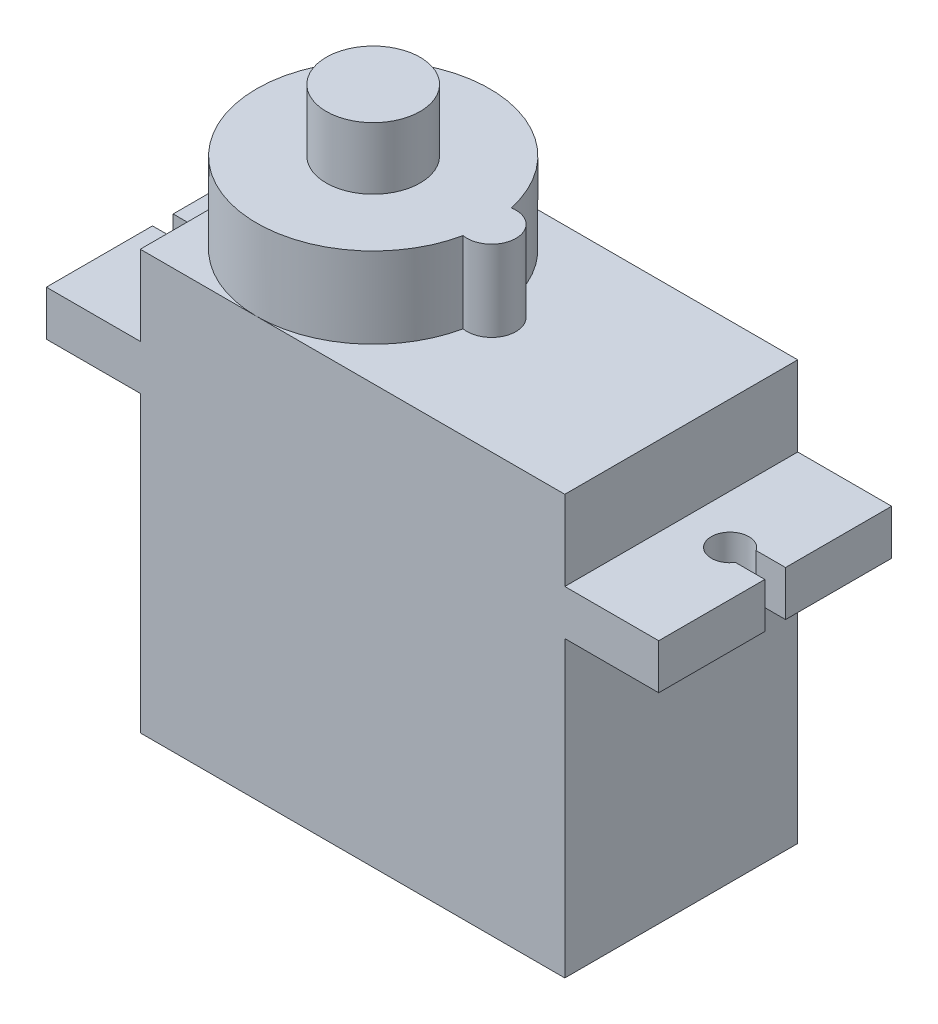
ISO-10303-21;
HEADER;
FILE_DESCRIPTION(('STEP AP214'),'2;1');
FILE_NAME('part.step','',(''),(''),'','','');
FILE_SCHEMA(('AUTOMOTIVE_DESIGN { 1 0 10303 214 1 1 1 1 }'));
ENDSEC;
DATA;
#1=APPLICATION_CONTEXT('core data for automotive mechanical design processes');
#2=APPLICATION_PROTOCOL_DEFINITION('international standard','automotive_design',2000,#1);
#3=PRODUCT_CONTEXT('',#1,'mechanical');
#4=PRODUCT('Part','Part','',(#3));
#5=PRODUCT_RELATED_PRODUCT_CATEGORY('part','',(#4));
#6=PRODUCT_DEFINITION_FORMATION('','',#4);
#7=PRODUCT_DEFINITION_CONTEXT('part definition',#1,'design');
#8=PRODUCT_DEFINITION('design','',#6,#7);
#9=PRODUCT_DEFINITION_SHAPE('','',#8);
#10=(LENGTH_UNIT() NAMED_UNIT(*) SI_UNIT(.MILLI.,.METRE.));
#11=(NAMED_UNIT(*) PLANE_ANGLE_UNIT() SI_UNIT($,.RADIAN.));
#12=(NAMED_UNIT(*) SI_UNIT($,.STERADIAN.) SOLID_ANGLE_UNIT());
#13=UNCERTAINTY_MEASURE_WITH_UNIT(LENGTH_MEASURE(1.E-05),#10,'distance_accuracy_value','');
#14=(GEOMETRIC_REPRESENTATION_CONTEXT(3) GLOBAL_UNCERTAINTY_ASSIGNED_CONTEXT((#13)) GLOBAL_UNIT_ASSIGNED_CONTEXT((#10,
#11,#12)) REPRESENTATION_CONTEXT('',''));
#15=CARTESIAN_POINT('',(0.,0.,0.));
#16=DIRECTION('',(0.,0.,1.));
#17=DIRECTION('',(1.,0.,0.));
#18=AXIS2_PLACEMENT_3D('',#15,#16,#17);
#19=CARTESIAN_POINT('',(-13.6,4.5,1.2));
#20=DIRECTION('',(1.,0.,0.));
#21=DIRECTION('',(0.,0.,-1.));
#22=AXIS2_PLACEMENT_3D('',#19,#20,#21);
#23=CYLINDRICAL_SURFACE('',#22,0.6);
#24=CARTESIAN_POINT('',(-13.6,4.5,1.2));
#25=DIRECTION('',(-1.,0.,0.));
#26=DIRECTION('',(0.,0.,1.));
#27=AXIS2_PLACEMENT_3D('',#24,#25,#26);
#28=CIRCLE('',#27,0.6);
#29=CARTESIAN_POINT('',(-13.6,4.5,1.8));
#30=VERTEX_POINT('',#29);
#31=EDGE_CURVE('E12',#30,#30,#28,.T.);
#32=ORIENTED_EDGE('',*,*,#31,.F.);
#33=EDGE_LOOP('',(#32));
#34=FACE_BOUND('',#33,.T.);
#35=CARTESIAN_POINT('',(-11.3,4.5,1.2));
#36=DIRECTION('',(-1.,0.,0.));
#37=DIRECTION('',(0.,0.,1.));
#38=AXIS2_PLACEMENT_3D('',#35,#36,#37);
#39=CIRCLE('',#38,0.6);
#40=CARTESIAN_POINT('',(-11.3,4.5,1.8));
#41=VERTEX_POINT('',#40);
#42=EDGE_CURVE('E53',#41,#41,#39,.T.);
#43=ORIENTED_EDGE('',*,*,#42,.T.);
#44=EDGE_LOOP('',(#43));
#45=FACE_BOUND('',#44,.T.);
#46=ADVANCED_FACE('F50',(#34,#45),#23,.T.);
#47=CARTESIAN_POINT('',(-13.6,0.,0.));
#48=DIRECTION('',(-1.,0.,0.));
#49=DIRECTION('',(0.,0.,1.));
#50=AXIS2_PLACEMENT_3D('',#47,#48,#49);
#51=PLANE('',#50);
#52=ORIENTED_EDGE('',*,*,#31,.T.);
#53=EDGE_LOOP('',(#52));
#54=FACE_BOUND('',#53,.T.);
#55=ADVANCED_FACE('F65',(#54),#51,.T.);
#56=CARTESIAN_POINT('',(-11.3,0.,0.));
#57=DIRECTION('',(-1.,0.,0.));
#58=DIRECTION('',(0.,0.,1.));
#59=AXIS2_PLACEMENT_3D('',#56,#57,#58);
#60=PLANE('',#59);
#61=ORIENTED_EDGE('',*,*,#42,.F.);
#62=EDGE_LOOP('',(#61));
#63=FACE_BOUND('',#62,.T.);
#64=ADVANCED_FACE('F63',(#63),#60,.F.);
#65=CLOSED_SHELL('',(#46,#55,#64));
#66=MANIFOLD_SOLID_BREP('B2',#65);
#67=CARTESIAN_POINT('',(-13.6,4.5,-1.2));
#68=DIRECTION('',(1.,0.,0.));
#69=DIRECTION('',(0.,0.,-1.));
#70=AXIS2_PLACEMENT_3D('',#67,#68,#69);
#71=CYLINDRICAL_SURFACE('',#70,0.6);
#72=CARTESIAN_POINT('',(-13.6,4.5,-1.2));
#73=DIRECTION('',(-1.,0.,0.));
#74=DIRECTION('',(0.,0.,1.));
#75=AXIS2_PLACEMENT_3D('',#72,#73,#74);
#76=CIRCLE('',#75,0.6);
#77=CARTESIAN_POINT('',(-13.6,4.5,-0.600000000000001));
#78=VERTEX_POINT('',#77);
#79=EDGE_CURVE('E49',#78,#78,#76,.T.);
#80=ORIENTED_EDGE('',*,*,#79,.F.);
#81=EDGE_LOOP('',(#80));
#82=FACE_BOUND('',#81,.T.);
#83=CARTESIAN_POINT('',(-11.3,4.5,-1.2));
#84=DIRECTION('',(-1.,0.,0.));
#85=DIRECTION('',(0.,0.,1.));
#86=AXIS2_PLACEMENT_3D('',#83,#84,#85);
#87=CIRCLE('',#86,0.6);
#88=CARTESIAN_POINT('',(-11.3,4.5,-0.600000000000001));
#89=VERTEX_POINT('',#88);
#90=EDGE_CURVE('E106',#89,#89,#87,.T.);
#91=ORIENTED_EDGE('',*,*,#90,.T.);
#92=EDGE_LOOP('',(#91));
#93=FACE_BOUND('',#92,.T.);
#94=ADVANCED_FACE('F103',(#82,#93),#71,.T.);
#95=CARTESIAN_POINT('',(-13.6,0.,0.));
#96=DIRECTION('',(-1.,0.,0.));
#97=DIRECTION('',(0.,0.,1.));
#98=AXIS2_PLACEMENT_3D('',#95,#96,#97);
#99=PLANE('',#98);
#100=ORIENTED_EDGE('',*,*,#79,.T.);
#101=EDGE_LOOP('',(#100));
#102=FACE_BOUND('',#101,.T.);
#103=ADVANCED_FACE('F118',(#102),#99,.T.);
#104=CARTESIAN_POINT('',(-11.3,0.,0.));
#105=DIRECTION('',(-1.,0.,0.));
#106=DIRECTION('',(0.,0.,1.));
#107=AXIS2_PLACEMENT_3D('',#104,#105,#106);
#108=PLANE('',#107);
#109=ORIENTED_EDGE('',*,*,#90,.F.);
#110=EDGE_LOOP('',(#109));
#111=FACE_BOUND('',#110,.T.);
#112=ADVANCED_FACE('F116',(#111),#108,.F.);
#113=CLOSED_SHELL('',(#94,#103,#112));
#114=MANIFOLD_SOLID_BREP('B7',#113);
#115=CARTESIAN_POINT('',(-13.6,4.5,0.));
#116=DIRECTION('',(1.,0.,0.));
#117=DIRECTION('',(0.,0.,-1.));
#118=AXIS2_PLACEMENT_3D('',#115,#116,#117);
#119=CYLINDRICAL_SURFACE('',#118,0.6);
#120=CARTESIAN_POINT('',(-13.6,4.5,0.));
#121=DIRECTION('',(-1.,0.,0.));
#122=DIRECTION('',(0.,0.,1.));
#123=AXIS2_PLACEMENT_3D('',#120,#121,#122);
#124=CIRCLE('',#123,0.6);
#125=CARTESIAN_POINT('',(-13.6,4.5,0.599999999999999));
#126=VERTEX_POINT('',#125);
#127=EDGE_CURVE('E102',#126,#126,#124,.T.);
#128=ORIENTED_EDGE('',*,*,#127,.F.);
#129=EDGE_LOOP('',(#128));
#130=FACE_BOUND('',#129,.T.);
#131=CARTESIAN_POINT('',(-11.3,4.5,0.));
#132=DIRECTION('',(-1.,0.,0.));
#133=DIRECTION('',(0.,0.,1.));
#134=AXIS2_PLACEMENT_3D('',#131,#132,#133);
#135=CIRCLE('',#134,0.6);
#136=CARTESIAN_POINT('',(-11.3,4.5,0.599999999999999));
#137=VERTEX_POINT('',#136);
#138=EDGE_CURVE('E160',#137,#137,#135,.T.);
#139=ORIENTED_EDGE('',*,*,#138,.T.);
#140=EDGE_LOOP('',(#139));
#141=FACE_BOUND('',#140,.T.);
#142=ADVANCED_FACE('F157',(#130,#141),#119,.T.);
#143=CARTESIAN_POINT('',(-13.6,0.,0.));
#144=DIRECTION('',(-1.,0.,0.));
#145=DIRECTION('',(0.,0.,1.));
#146=AXIS2_PLACEMENT_3D('',#143,#144,#145);
#147=PLANE('',#146);
#148=ORIENTED_EDGE('',*,*,#127,.T.);
#149=EDGE_LOOP('',(#148));
#150=FACE_BOUND('',#149,.T.);
#151=ADVANCED_FACE('F172',(#150),#147,.T.);
#152=CARTESIAN_POINT('',(-11.3,0.,0.));
#153=DIRECTION('',(-1.,0.,0.));
#154=DIRECTION('',(0.,0.,1.));
#155=AXIS2_PLACEMENT_3D('',#152,#153,#154);
#156=PLANE('',#155);
#157=ORIENTED_EDGE('',*,*,#138,.F.);
#158=EDGE_LOOP('',(#157));
#159=FACE_BOUND('',#158,.T.);
#160=ADVANCED_FACE('F170',(#159),#156,.F.);
#161=CLOSED_SHELL('',(#142,#151,#160));
#162=MANIFOLD_SOLID_BREP('B44',#161);
#163=CARTESIAN_POINT('',(0.,22.3,0.));
#164=DIRECTION('',(0.,-1.,0.));
#165=DIRECTION('',(0.,0.,-1.));
#166=AXIS2_PLACEMENT_3D('',#163,#164,#165);
#167=PLANE('',#166);
#168=CARTESIAN_POINT('',(1.2,22.3,0.));
#169=DIRECTION('',(0.,1.,0.));
#170=DIRECTION('',(0.,0.,1.));
#171=AXIS2_PLACEMENT_3D('',#168,#169,#170);
#172=CIRCLE('',#171,1.3);
#173=CARTESIAN_POINT('',(0.966666666666667,22.3,1.27888840621673));
#174=VERTEX_POINT('',#173);
#175=CARTESIAN_POINT('',(0.966666666666667,22.3,-1.27888840621673));
#176=VERTEX_POINT('',#175);
#177=EDGE_CURVE('E377',#174,#176,#172,.T.);
#178=ORIENTED_EDGE('',*,*,#177,.F.);
#179=CARTESIAN_POINT('',(-5.1,22.3,0.));
#180=DIRECTION('',(0.,1.,0.));
#181=DIRECTION('',(0.,0.,1.));
#182=AXIS2_PLACEMENT_3D('',#179,#180,#181);
#183=CIRCLE('',#182,6.2);
#184=CARTESIAN_POINT('',(-5.1,22.3,6.2));
#185=VERTEX_POINT('',#184);
#186=EDGE_CURVE('E225',#185,#174,#183,.T.);
#187=ORIENTED_EDGE('',*,*,#186,.F.);
#188=DIRECTION('',(1.,0.,0.));
#189=VECTOR('',#188,1.);
#190=CARTESIAN_POINT('',(-11.3,22.3,6.2));
#191=LINE('',#190,#189);
#192=CARTESIAN_POINT('',(11.3,22.3,6.2));
#193=VERTEX_POINT('',#192);
#194=EDGE_CURVE('E505',#185,#193,#191,.T.);
#195=ORIENTED_EDGE('',*,*,#194,.T.);
#196=DIRECTION('',(0.,0.,-1.));
#197=VECTOR('',#196,1.);
#198=CARTESIAN_POINT('',(11.3,22.3,6.2));
#199=LINE('',#198,#197);
#200=CARTESIAN_POINT('',(11.3,22.3,-6.2));
#201=VERTEX_POINT('',#200);
#202=EDGE_CURVE('E494',#193,#201,#199,.T.);
#203=ORIENTED_EDGE('',*,*,#202,.T.);
#204=DIRECTION('',(-1.,0.,0.));
#205=VECTOR('',#204,1.);
#206=CARTESIAN_POINT('',(-11.3,22.3,-6.2));
#207=LINE('',#206,#205);
#208=CARTESIAN_POINT('',(-5.1,22.3,-6.2));
#209=VERTEX_POINT('',#208);
#210=EDGE_CURVE('E499',#201,#209,#207,.T.);
#211=ORIENTED_EDGE('',*,*,#210,.T.);
#212=EDGE_CURVE('E219',#176,#209,#183,.T.);
#213=ORIENTED_EDGE('',*,*,#212,.F.);
#214=EDGE_LOOP('',(#178,#187,#195,#203,#211,#213));
#215=FACE_BOUND('',#214,.T.);
#216=ADVANCED_FACE('F202',(#215),#167,.F.);
#217=CARTESIAN_POINT('',(-11.3,22.3,0.));
#218=VERTEX_POINT('',#217);
#219=EDGE_CURVE('E211',#209,#218,#183,.T.);
#220=ORIENTED_EDGE('',*,*,#219,.F.);
#221=CARTESIAN_POINT('',(-11.3,22.3,-6.2));
#222=VERTEX_POINT('',#221);
#223=EDGE_CURVE('E497',#209,#222,#207,.T.);
#224=ORIENTED_EDGE('',*,*,#223,.T.);
#225=DIRECTION('',(0.,0.,1.));
#226=VECTOR('',#225,1.);
#227=CARTESIAN_POINT('',(-11.3,22.3,6.2));
#228=LINE('',#227,#226);
#229=EDGE_CURVE('E502',#222,#218,#228,.T.);
#230=ORIENTED_EDGE('',*,*,#229,.T.);
#231=EDGE_LOOP('',(#220,#224,#230));
#232=FACE_BOUND('',#231,.T.);
#233=ADVANCED_FACE('F595',(#232),#167,.F.);
#234=CARTESIAN_POINT('',(16.3,0.,0.));
#235=DIRECTION('',(1.,0.,0.));
#236=DIRECTION('',(0.,0.,-1.));
#237=AXIS2_PLACEMENT_3D('',#234,#235,#236);
#238=PLANE('',#237);
#239=DIRECTION('',(0.,1.,0.));
#240=VECTOR('',#239,1.);
#241=CARTESIAN_POINT('',(16.3,-0.001000000000001,-0.550000000000001));
#242=LINE('',#241,#240);
#243=CARTESIAN_POINT('',(16.3,15.65,-0.550000000000001));
#244=VERTEX_POINT('',#243);
#245=CARTESIAN_POINT('',(16.3,18.05,-0.550000000000001));
#246=VERTEX_POINT('',#245);
#247=EDGE_CURVE('E404',#244,#246,#242,.T.);
#248=ORIENTED_EDGE('',*,*,#247,.F.);
#249=DIRECTION('',(0.,0.,-1.));
#250=VECTOR('',#249,1.);
#251=CARTESIAN_POINT('',(16.3,15.65,6.2));
#252=LINE('',#251,#250);
#253=CARTESIAN_POINT('',(16.3,15.65,-6.2));
#254=VERTEX_POINT('',#253);
#255=EDGE_CURVE('E466',#244,#254,#252,.T.);
#256=ORIENTED_EDGE('',*,*,#255,.T.);
#257=DIRECTION('',(0.,1.,0.));
#258=VECTOR('',#257,1.);
#259=CARTESIAN_POINT('',(16.3,18.05,-6.2));
#260=LINE('',#259,#258);
#261=CARTESIAN_POINT('',(16.3,18.05,-6.2));
#262=VERTEX_POINT('',#261);
#263=EDGE_CURVE('E471',#254,#262,#260,.T.);
#264=ORIENTED_EDGE('',*,*,#263,.T.);
#265=DIRECTION('',(0.,0.,1.));
#266=VECTOR('',#265,1.);
#267=CARTESIAN_POINT('',(16.3,18.05,6.2));
#268=LINE('',#267,#266);
#269=EDGE_CURVE('E474',#262,#246,#268,.T.);
#270=ORIENTED_EDGE('',*,*,#269,.T.);
#271=EDGE_LOOP('',(#248,#256,#264,#270));
#272=FACE_BOUND('',#271,.T.);
#273=ADVANCED_FACE('F600',(#272),#238,.T.);
#274=CARTESIAN_POINT('',(-16.3,0.,0.));
#275=DIRECTION('',(-1.,0.,0.));
#276=DIRECTION('',(0.,0.,1.));
#277=AXIS2_PLACEMENT_3D('',#274,#275,#276);
#278=PLANE('',#277);
#279=DIRECTION('',(0.,1.,0.));
#280=VECTOR('',#279,1.);
#281=CARTESIAN_POINT('',(-16.3,-0.001000000000001,-0.55));
#282=LINE('',#281,#280);
#283=CARTESIAN_POINT('',(-16.3,15.65,-0.55));
#284=VERTEX_POINT('',#283);
#285=CARTESIAN_POINT('',(-16.3,18.05,-0.55));
#286=VERTEX_POINT('',#285);
#287=EDGE_CURVE('E424',#284,#286,#282,.T.);
#288=ORIENTED_EDGE('',*,*,#287,.T.);
#289=DIRECTION('',(0.,0.,-1.));
#290=VECTOR('',#289,1.);
#291=CARTESIAN_POINT('',(-16.3,18.05,6.2));
#292=LINE('',#291,#290);
#293=CARTESIAN_POINT('',(-16.3,18.05,-6.2));
#294=VERTEX_POINT('',#293);
#295=EDGE_CURVE('E437',#286,#294,#292,.T.);
#296=ORIENTED_EDGE('',*,*,#295,.T.);
#297=DIRECTION('',(0.,-1.,0.));
#298=VECTOR('',#297,1.);
#299=CARTESIAN_POINT('',(-16.3,18.05,-6.2));
#300=LINE('',#299,#298);
#301=CARTESIAN_POINT('',(-16.3,15.65,-6.2));
#302=VERTEX_POINT('',#301);
#303=EDGE_CURVE('E436',#294,#302,#300,.T.);
#304=ORIENTED_EDGE('',*,*,#303,.T.);
#305=DIRECTION('',(0.,0.,1.));
#306=VECTOR('',#305,1.);
#307=CARTESIAN_POINT('',(-16.3,15.65,-6.2));
#308=LINE('',#307,#306);
#309=EDGE_CURVE('E440',#302,#284,#308,.T.);
#310=ORIENTED_EDGE('',*,*,#309,.T.);
#311=EDGE_LOOP('',(#288,#296,#304,#310));
#312=FACE_BOUND('',#311,.T.);
#313=ADVANCED_FACE('F617',(#312),#278,.T.);
#314=CARTESIAN_POINT('',(-11.3,22.3,6.2));
#315=DIRECTION('',(1.,0.,0.));
#316=DIRECTION('',(0.,0.,-1.));
#317=AXIS2_PLACEMENT_3D('',#314,#315,#316);
#318=PLANE('',#317);
#319=DIRECTION('',(0.,0.,-1.));
#320=VECTOR('',#319,1.);
#321=CARTESIAN_POINT('',(-11.3,18.05,6.2));
#322=LINE('',#321,#320);
#323=CARTESIAN_POINT('',(-11.3,18.05,6.2));
#324=VERTEX_POINT('',#323);
#325=CARTESIAN_POINT('',(-11.3,18.05,-6.2));
#326=VERTEX_POINT('',#325);
#327=EDGE_CURVE('E411',#324,#326,#322,.T.);
#328=ORIENTED_EDGE('',*,*,#327,.F.);
#329=DIRECTION('',(0.,-1.,0.));
#330=VECTOR('',#329,1.);
#331=CARTESIAN_POINT('',(-11.3,22.3,6.2));
#332=LINE('',#331,#330);
#333=CARTESIAN_POINT('',(-11.3,22.3,6.2));
#334=VERTEX_POINT('',#333);
#335=EDGE_CURVE('E523',#334,#324,#332,.T.);
#336=ORIENTED_EDGE('',*,*,#335,.F.);
#337=EDGE_CURVE('E501',#218,#334,#228,.T.);
#338=ORIENTED_EDGE('',*,*,#337,.F.);
#339=ORIENTED_EDGE('',*,*,#229,.F.);
#340=DIRECTION('',(0.,-1.,0.));
#341=VECTOR('',#340,1.);
#342=CARTESIAN_POINT('',(-11.3,22.3,-6.2));
#343=LINE('',#342,#341);
#344=EDGE_CURVE('E526',#222,#326,#343,.T.);
#345=ORIENTED_EDGE('',*,*,#344,.T.);
#346=EDGE_LOOP('',(#328,#336,#338,#339,#345));
#347=FACE_BOUND('',#346,.T.);
#348=ADVANCED_FACE('F565',(#347),#318,.F.);
#349=DIRECTION('',(0.,0.,1.));
#350=VECTOR('',#349,1.);
#351=CARTESIAN_POINT('',(-11.3,15.65,-6.2));
#352=LINE('',#351,#350);
#353=CARTESIAN_POINT('',(-11.3,15.65,-6.2));
#354=VERTEX_POINT('',#353);
#355=CARTESIAN_POINT('',(-11.3,15.65,6.2));
#356=VERTEX_POINT('',#355);
#357=EDGE_CURVE('E448',#354,#356,#352,.T.);
#358=ORIENTED_EDGE('',*,*,#357,.F.);
#359=CARTESIAN_POINT('',(-11.3,0.,-6.2));
#360=VERTEX_POINT('',#359);
#361=EDGE_CURVE('E525',#354,#360,#343,.T.);
#362=ORIENTED_EDGE('',*,*,#361,.T.);
#363=DIRECTION('',(0.,0.,1.));
#364=VECTOR('',#363,1.);
#365=CARTESIAN_POINT('',(-11.3,0.,6.2));
#366=LINE('',#365,#364);
#367=CARTESIAN_POINT('',(-11.3,0.,6.2));
#368=VERTEX_POINT('',#367);
#369=EDGE_CURVE('E515',#360,#368,#366,.T.);
#370=ORIENTED_EDGE('',*,*,#369,.T.);
#371=EDGE_CURVE('E522',#356,#368,#332,.T.);
#372=ORIENTED_EDGE('',*,*,#371,.F.);
#373=EDGE_LOOP('',(#358,#362,#370,#372));
#374=FACE_BOUND('',#373,.T.);
#375=ADVANCED_FACE('F533',(#374),#318,.F.);
#376=CARTESIAN_POINT('',(11.3,22.3,6.2));
#377=DIRECTION('',(-1.,0.,0.));
#378=DIRECTION('',(0.,0.,1.));
#379=AXIS2_PLACEMENT_3D('',#376,#377,#378);
#380=PLANE('',#379);
#381=DIRECTION('',(0.,0.,1.));
#382=VECTOR('',#381,1.);
#383=CARTESIAN_POINT('',(11.3,18.05,6.2));
#384=LINE('',#383,#382);
#385=CARTESIAN_POINT('',(11.3,18.05,-6.2));
#386=VERTEX_POINT('',#385);
#387=CARTESIAN_POINT('',(11.3,18.05,6.2));
#388=VERTEX_POINT('',#387);
#389=EDGE_CURVE('E467',#386,#388,#384,.T.);
#390=ORIENTED_EDGE('',*,*,#389,.F.);
#391=DIRECTION('',(0.,-1.,0.));
#392=VECTOR('',#391,1.);
#393=CARTESIAN_POINT('',(11.3,22.3,-6.2));
#394=LINE('',#393,#392);
#395=EDGE_CURVE('E206',#201,#386,#394,.T.);
#396=ORIENTED_EDGE('',*,*,#395,.F.);
#397=ORIENTED_EDGE('',*,*,#202,.F.);
#398=DIRECTION('',(0.,-1.,0.));
#399=VECTOR('',#398,1.);
#400=CARTESIAN_POINT('',(11.3,22.3,6.2));
#401=LINE('',#400,#399);
#402=EDGE_CURVE('E520',#193,#388,#401,.T.);
#403=ORIENTED_EDGE('',*,*,#402,.T.);
#404=EDGE_LOOP('',(#390,#396,#397,#403));
#405=FACE_BOUND('',#404,.T.);
#406=ADVANCED_FACE('F204',(#405),#380,.F.);
#407=DIRECTION('',(0.,0.,-1.));
#408=VECTOR('',#407,1.);
#409=CARTESIAN_POINT('',(11.3,15.65,6.2));
#410=LINE('',#409,#408);
#411=CARTESIAN_POINT('',(11.3,15.65,6.2));
#412=VERTEX_POINT('',#411);
#413=CARTESIAN_POINT('',(11.3,15.65,-6.2));
#414=VERTEX_POINT('',#413);
#415=EDGE_CURVE('E462',#412,#414,#410,.T.);
#416=ORIENTED_EDGE('',*,*,#415,.F.);
#417=CARTESIAN_POINT('',(11.3,0.,6.2));
#418=VERTEX_POINT('',#417);
#419=EDGE_CURVE('E509',#412,#418,#401,.T.);
#420=ORIENTED_EDGE('',*,*,#419,.T.);
#421=DIRECTION('',(0.,0.,-1.));
#422=VECTOR('',#421,1.);
#423=CARTESIAN_POINT('',(11.3,0.,6.2));
#424=LINE('',#423,#422);
#425=CARTESIAN_POINT('',(11.3,0.,-6.2));
#426=VERTEX_POINT('',#425);
#427=EDGE_CURVE('E493',#418,#426,#424,.T.);
#428=ORIENTED_EDGE('',*,*,#427,.T.);
#429=EDGE_CURVE('E527',#414,#426,#394,.T.);
#430=ORIENTED_EDGE('',*,*,#429,.F.);
#431=EDGE_LOOP('',(#416,#420,#428,#430));
#432=FACE_BOUND('',#431,.T.);
#433=ADVANCED_FACE('F614',(#432),#380,.F.);
#434=CARTESIAN_POINT('',(-11.3,22.3,-6.2));
#435=DIRECTION('',(0.,0.,1.));
#436=DIRECTION('',(1.,0.,0.));
#437=AXIS2_PLACEMENT_3D('',#434,#435,#436);
#438=PLANE('',#437);
#439=DIRECTION('',(-1.,0.,0.));
#440=VECTOR('',#439,1.);
#441=CARTESIAN_POINT('',(-11.3,0.,-6.2));
#442=LINE('',#441,#440);
#443=EDGE_CURVE('E512',#426,#360,#442,.T.);
#444=ORIENTED_EDGE('',*,*,#443,.T.);
#445=ORIENTED_EDGE('',*,*,#361,.F.);
#446=DIRECTION('',(1.,0.,0.));
#447=VECTOR('',#446,1.);
#448=CARTESIAN_POINT('',(-16.3,15.65,-6.2));
#449=LINE('',#448,#447);
#450=EDGE_CURVE('E456',#302,#354,#449,.T.);
#451=ORIENTED_EDGE('',*,*,#450,.F.);
#452=ORIENTED_EDGE('',*,*,#303,.F.);
#453=DIRECTION('',(1.,0.,0.));
#454=VECTOR('',#453,1.);
#455=CARTESIAN_POINT('',(-16.3,18.05,-6.2));
#456=LINE('',#455,#454);
#457=EDGE_CURVE('E459',#294,#326,#456,.T.);
#458=ORIENTED_EDGE('',*,*,#457,.T.);
#459=ORIENTED_EDGE('',*,*,#344,.F.);
#460=ORIENTED_EDGE('',*,*,#223,.F.);
#461=ORIENTED_EDGE('',*,*,#210,.F.);
#462=ORIENTED_EDGE('',*,*,#395,.T.);
#463=DIRECTION('',(-1.,0.,0.));
#464=VECTOR('',#463,1.);
#465=CARTESIAN_POINT('',(16.3,18.05,-6.2));
#466=LINE('',#465,#464);
#467=EDGE_CURVE('E484',#262,#386,#466,.T.);
#468=ORIENTED_EDGE('',*,*,#467,.F.);
#469=ORIENTED_EDGE('',*,*,#263,.F.);
#470=DIRECTION('',(-1.,0.,0.));
#471=VECTOR('',#470,1.);
#472=CARTESIAN_POINT('',(16.3,15.65,-6.2));
#473=LINE('',#472,#471);
#474=EDGE_CURVE('E487',#254,#414,#473,.T.);
#475=ORIENTED_EDGE('',*,*,#474,.T.);
#476=ORIENTED_EDGE('',*,*,#429,.T.);
#477=EDGE_LOOP('',(#444,#445,#451,#452,#458,#459,#460,#461,#462,#468,#469,#475,#476));
#478=FACE_BOUND('',#477,.T.);
#479=ADVANCED_FACE('F539',(#478),#438,.F.);
#480=CARTESIAN_POINT('',(-11.3,22.3,6.2));
#481=DIRECTION('',(0.,0.,-1.));
#482=DIRECTION('',(-1.,0.,0.));
#483=AXIS2_PLACEMENT_3D('',#480,#481,#482);
#484=PLANE('',#483);
#485=DIRECTION('',(1.,0.,0.));
#486=VECTOR('',#485,1.);
#487=CARTESIAN_POINT('',(-11.3,0.,6.2));
#488=LINE('',#487,#486);
#489=EDGE_CURVE('E498',#368,#418,#488,.T.);
#490=ORIENTED_EDGE('',*,*,#489,.T.);
#491=ORIENTED_EDGE('',*,*,#419,.F.);
#492=DIRECTION('',(-1.,0.,0.));
#493=VECTOR('',#492,1.);
#494=CARTESIAN_POINT('',(16.3,15.65,6.2));
#495=LINE('',#494,#493);
#496=CARTESIAN_POINT('',(16.3,15.65,6.2));
#497=VERTEX_POINT('',#496);
#498=EDGE_CURVE('E490',#497,#412,#495,.T.);
#499=ORIENTED_EDGE('',*,*,#498,.F.);
#500=DIRECTION('',(0.,-1.,0.));
#501=VECTOR('',#500,1.);
#502=CARTESIAN_POINT('',(16.3,18.05,6.2));
#503=LINE('',#502,#501);
#504=CARTESIAN_POINT('',(16.3,18.05,6.2));
#505=VERTEX_POINT('',#504);
#506=EDGE_CURVE('E463',#505,#497,#503,.T.);
#507=ORIENTED_EDGE('',*,*,#506,.F.);
#508=DIRECTION('',(-1.,0.,0.));
#509=VECTOR('',#508,1.);
#510=CARTESIAN_POINT('',(16.3,18.05,6.2));
#511=LINE('',#510,#509);
#512=EDGE_CURVE('E477',#505,#388,#511,.T.);
#513=ORIENTED_EDGE('',*,*,#512,.T.);
#514=ORIENTED_EDGE('',*,*,#402,.F.);
#515=ORIENTED_EDGE('',*,*,#194,.F.);
#516=EDGE_CURVE('E506',#334,#185,#191,.T.);
#517=ORIENTED_EDGE('',*,*,#516,.F.);
#518=ORIENTED_EDGE('',*,*,#335,.T.);
#519=DIRECTION('',(1.,0.,0.));
#520=VECTOR('',#519,1.);
#521=CARTESIAN_POINT('',(-16.3,18.05,6.2));
#522=LINE('',#521,#520);
#523=CARTESIAN_POINT('',(-16.3,18.05,6.2));
#524=VERTEX_POINT('',#523);
#525=EDGE_CURVE('E445',#524,#324,#522,.T.);
#526=ORIENTED_EDGE('',*,*,#525,.F.);
#527=DIRECTION('',(0.,1.,0.));
#528=VECTOR('',#527,1.);
#529=CARTESIAN_POINT('',(-16.3,15.65,6.2));
#530=LINE('',#529,#528);
#531=CARTESIAN_POINT('',(-16.3,15.65,6.2));
#532=VERTEX_POINT('',#531);
#533=EDGE_CURVE('E443',#532,#524,#530,.T.);
#534=ORIENTED_EDGE('',*,*,#533,.F.);
#535=DIRECTION('',(1.,0.,0.));
#536=VECTOR('',#535,1.);
#537=CARTESIAN_POINT('',(-16.3,15.65,6.2));
#538=LINE('',#537,#536);
#539=EDGE_CURVE('E453',#532,#356,#538,.T.);
#540=ORIENTED_EDGE('',*,*,#539,.T.);
#541=ORIENTED_EDGE('',*,*,#371,.T.);
#542=EDGE_LOOP('',(#490,#491,#499,#507,#513,#514,#515,#517,#518,#526,#534,#540,#541));
#543=FACE_BOUND('',#542,.T.);
#544=ADVANCED_FACE('F545',(#543),#484,.F.);
#545=EDGE_CURVE('E572',#218,#185,#183,.T.);
#546=ORIENTED_EDGE('',*,*,#545,.F.);
#547=ORIENTED_EDGE('',*,*,#337,.T.);
#548=ORIENTED_EDGE('',*,*,#516,.T.);
#549=EDGE_LOOP('',(#546,#547,#548));
#550=FACE_BOUND('',#549,.T.);
#551=ADVANCED_FACE('F571',(#550),#167,.F.);
#552=CARTESIAN_POINT('',(0.,0.,0.));
#553=DIRECTION('',(0.,-1.,0.));
#554=DIRECTION('',(0.,0.,-1.));
#555=AXIS2_PLACEMENT_3D('',#552,#553,#554);
#556=PLANE('',#555);
#557=ORIENTED_EDGE('',*,*,#427,.F.);
#558=ORIENTED_EDGE('',*,*,#489,.F.);
#559=ORIENTED_EDGE('',*,*,#369,.F.);
#560=ORIENTED_EDGE('',*,*,#443,.F.);
#561=EDGE_LOOP('',(#557,#558,#559,#560));
#562=FACE_BOUND('',#561,.T.);
#563=ADVANCED_FACE('F542',(#562),#556,.T.);
#564=CARTESIAN_POINT('',(16.3,15.65,6.2));
#565=DIRECTION('',(0.,1.,0.));
#566=DIRECTION('',(0.,0.,1.));
#567=AXIS2_PLACEMENT_3D('',#564,#565,#566);
#568=PLANE('',#567);
#569=ORIENTED_EDGE('',*,*,#255,.F.);
#570=DIRECTION('',(1.,0.,0.));
#571=VECTOR('',#570,1.);
#572=CARTESIAN_POINT('',(16.3,15.65,-0.550000000000001));
#573=LINE('',#572,#571);
#574=CARTESIAN_POINT('',(14.7351646544245,15.65,-0.550000000000001));
#575=VERTEX_POINT('',#574);
#576=EDGE_CURVE('E389',#575,#244,#573,.T.);
#577=ORIENTED_EDGE('',*,*,#576,.F.);
#578=CARTESIAN_POINT('',(13.9,15.65,0.));
#579=DIRECTION('',(0.,1.,0.));
#580=DIRECTION('',(0.,0.,1.));
#581=AXIS2_PLACEMENT_3D('',#578,#579,#580);
#582=CIRCLE('',#581,1.);
#583=CARTESIAN_POINT('',(14.7351646544245,15.65,0.549999999999999));
#584=VERTEX_POINT('',#583);
#585=EDGE_CURVE('E386',#584,#575,#582,.F.);
#586=ORIENTED_EDGE('',*,*,#585,.F.);
#587=DIRECTION('',(-1.,0.,0.));
#588=VECTOR('',#587,1.);
#589=CARTESIAN_POINT('',(16.3,15.65,0.549999999999999));
#590=LINE('',#589,#588);
#591=CARTESIAN_POINT('',(16.3,15.65,0.549999999999999));
#592=VERTEX_POINT('',#591);
#593=EDGE_CURVE('E403',#592,#584,#590,.T.);
#594=ORIENTED_EDGE('',*,*,#593,.F.);
#595=EDGE_CURVE('E468',#497,#592,#252,.T.);
#596=ORIENTED_EDGE('',*,*,#595,.F.);
#597=ORIENTED_EDGE('',*,*,#498,.T.);
#598=ORIENTED_EDGE('',*,*,#415,.T.);
#599=ORIENTED_EDGE('',*,*,#474,.F.);
#600=EDGE_LOOP('',(#569,#577,#586,#594,#596,#597,#598,#599));
#601=FACE_BOUND('',#600,.T.);
#602=ADVANCED_FACE('F609',(#601),#568,.F.);
#603=CARTESIAN_POINT('',(16.3,18.05,6.2));
#604=DIRECTION('',(0.,-1.,0.));
#605=DIRECTION('',(0.,0.,-1.));
#606=AXIS2_PLACEMENT_3D('',#603,#604,#605);
#607=PLANE('',#606);
#608=CARTESIAN_POINT('',(13.9,18.05,0.));
#609=DIRECTION('',(0.,1.,0.));
#610=DIRECTION('',(0.,0.,1.));
#611=AXIS2_PLACEMENT_3D('',#608,#609,#610);
#612=CIRCLE('',#611,1.);
#613=CARTESIAN_POINT('',(14.7351646544245,18.05,-0.550000000000001));
#614=VERTEX_POINT('',#613);
#615=CARTESIAN_POINT('',(14.7351646544245,18.05,0.549999999999999));
#616=VERTEX_POINT('',#615);
#617=EDGE_CURVE('E392',#614,#616,#612,.T.);
#618=ORIENTED_EDGE('',*,*,#617,.F.);
#619=DIRECTION('',(-1.,0.,0.));
#620=VECTOR('',#619,1.);
#621=CARTESIAN_POINT('',(16.3,18.05,-0.550000000000001));
#622=LINE('',#621,#620);
#623=EDGE_CURVE('E397',#246,#614,#622,.T.);
#624=ORIENTED_EDGE('',*,*,#623,.F.);
#625=ORIENTED_EDGE('',*,*,#269,.F.);
#626=ORIENTED_EDGE('',*,*,#467,.T.);
#627=ORIENTED_EDGE('',*,*,#389,.T.);
#628=ORIENTED_EDGE('',*,*,#512,.F.);
#629=CARTESIAN_POINT('',(16.3,18.05,0.550000000000001));
#630=VERTEX_POINT('',#629);
#631=EDGE_CURVE('E473',#630,#505,#268,.T.);
#632=ORIENTED_EDGE('',*,*,#631,.F.);
#633=DIRECTION('',(1.,0.,0.));
#634=VECTOR('',#633,1.);
#635=CARTESIAN_POINT('',(16.3,18.05,0.549999999999999));
#636=LINE('',#635,#634);
#637=EDGE_CURVE('E395',#616,#630,#636,.T.);
#638=ORIENTED_EDGE('',*,*,#637,.F.);
#639=EDGE_LOOP('',(#618,#624,#625,#626,#627,#628,#632,#638));
#640=FACE_BOUND('',#639,.T.);
#641=ADVANCED_FACE('F800',(#640),#607,.F.);
#642=DIRECTION('',(0.,1.,0.));
#643=VECTOR('',#642,1.);
#644=CARTESIAN_POINT('',(16.3,-0.001000000000001,0.549999999999999));
#645=LINE('',#644,#643);
#646=EDGE_CURVE('E406',#592,#630,#645,.T.);
#647=ORIENTED_EDGE('',*,*,#646,.T.);
#648=ORIENTED_EDGE('',*,*,#631,.T.);
#649=ORIENTED_EDGE('',*,*,#506,.T.);
#650=ORIENTED_EDGE('',*,*,#595,.T.);
#651=EDGE_LOOP('',(#647,#648,#649,#650));
#652=FACE_BOUND('',#651,.T.);
#653=ADVANCED_FACE('F629',(#652),#238,.T.);
#654=CARTESIAN_POINT('',(-16.3,18.05,6.2));
#655=DIRECTION('',(0.,-1.,0.));
#656=DIRECTION('',(0.,0.,-1.));
#657=AXIS2_PLACEMENT_3D('',#654,#655,#656);
#658=PLANE('',#657);
#659=ORIENTED_EDGE('',*,*,#295,.F.);
#660=DIRECTION('',(-1.,0.,0.));
#661=VECTOR('',#660,1.);
#662=CARTESIAN_POINT('',(-16.3,18.05,-0.55));
#663=LINE('',#662,#661);
#664=CARTESIAN_POINT('',(-14.7351646544245,18.05,-0.55));
#665=VERTEX_POINT('',#664);
#666=EDGE_CURVE('E421',#665,#286,#663,.T.);
#667=ORIENTED_EDGE('',*,*,#666,.F.);
#668=CARTESIAN_POINT('',(-13.9,18.05,0.));
#669=DIRECTION('',(0.,1.,0.));
#670=DIRECTION('',(0.,0.,1.));
#671=AXIS2_PLACEMENT_3D('',#668,#669,#670);
#672=CIRCLE('',#671,1.);
#673=CARTESIAN_POINT('',(-14.7351646544245,18.05,0.55));
#674=VERTEX_POINT('',#673);
#675=EDGE_CURVE('E418',#674,#665,#672,.T.);
#676=ORIENTED_EDGE('',*,*,#675,.F.);
#677=DIRECTION('',(1.,0.,0.));
#678=VECTOR('',#677,1.);
#679=CARTESIAN_POINT('',(-16.3,18.05,0.55));
#680=LINE('',#679,#678);
#681=CARTESIAN_POINT('',(-16.3,18.05,0.55));
#682=VERTEX_POINT('',#681);
#683=EDGE_CURVE('E415',#682,#674,#680,.T.);
#684=ORIENTED_EDGE('',*,*,#683,.F.);
#685=EDGE_CURVE('E433',#524,#682,#292,.T.);
#686=ORIENTED_EDGE('',*,*,#685,.F.);
#687=ORIENTED_EDGE('',*,*,#525,.T.);
#688=ORIENTED_EDGE('',*,*,#327,.T.);
#689=ORIENTED_EDGE('',*,*,#457,.F.);
#690=EDGE_LOOP('',(#659,#667,#676,#684,#686,#687,#688,#689));
#691=FACE_BOUND('',#690,.T.);
#692=ADVANCED_FACE('F560',(#691),#658,.F.);
#693=CARTESIAN_POINT('',(-16.3,15.65,-6.2));
#694=DIRECTION('',(0.,1.,0.));
#695=DIRECTION('',(0.,0.,1.));
#696=AXIS2_PLACEMENT_3D('',#693,#694,#695);
#697=PLANE('',#696);
#698=CARTESIAN_POINT('',(-13.9,15.65,0.));
#699=DIRECTION('',(0.,1.,0.));
#700=DIRECTION('',(0.,0.,1.));
#701=AXIS2_PLACEMENT_3D('',#698,#699,#700);
#702=CIRCLE('',#701,1.);
#703=CARTESIAN_POINT('',(-14.7351646544245,15.65,-0.55));
#704=VERTEX_POINT('',#703);
#705=CARTESIAN_POINT('',(-14.7351646544245,15.65,0.55));
#706=VERTEX_POINT('',#705);
#707=EDGE_CURVE('E378',#704,#706,#702,.F.);
#708=ORIENTED_EDGE('',*,*,#707,.F.);
#709=DIRECTION('',(1.,0.,0.));
#710=VECTOR('',#709,1.);
#711=CARTESIAN_POINT('',(-16.3,15.65,-0.55));
#712=LINE('',#711,#710);
#713=EDGE_CURVE('E381',#284,#704,#712,.T.);
#714=ORIENTED_EDGE('',*,*,#713,.F.);
#715=ORIENTED_EDGE('',*,*,#309,.F.);
#716=ORIENTED_EDGE('',*,*,#450,.T.);
#717=ORIENTED_EDGE('',*,*,#357,.T.);
#718=ORIENTED_EDGE('',*,*,#539,.F.);
#719=CARTESIAN_POINT('',(-16.3,15.65,0.549999999999997));
#720=VERTEX_POINT('',#719);
#721=EDGE_CURVE('E439',#720,#532,#308,.T.);
#722=ORIENTED_EDGE('',*,*,#721,.F.);
#723=DIRECTION('',(-1.,0.,0.));
#724=VECTOR('',#723,1.);
#725=CARTESIAN_POINT('',(-16.3,15.65,0.55));
#726=LINE('',#725,#724);
#727=EDGE_CURVE('E390',#706,#720,#726,.T.);
#728=ORIENTED_EDGE('',*,*,#727,.F.);
#729=EDGE_LOOP('',(#708,#714,#715,#716,#717,#718,#722,#728));
#730=FACE_BOUND('',#729,.T.);
#731=ADVANCED_FACE('F551',(#730),#697,.F.);
#732=DIRECTION('',(0.,1.,0.));
#733=VECTOR('',#732,1.);
#734=CARTESIAN_POINT('',(-16.3,-0.001000000000001,0.55));
#735=LINE('',#734,#733);
#736=EDGE_CURVE('E423',#720,#682,#735,.T.);
#737=ORIENTED_EDGE('',*,*,#736,.F.);
#738=ORIENTED_EDGE('',*,*,#721,.T.);
#739=ORIENTED_EDGE('',*,*,#533,.T.);
#740=ORIENTED_EDGE('',*,*,#685,.T.);
#741=EDGE_LOOP('',(#737,#738,#739,#740));
#742=FACE_BOUND('',#741,.T.);
#743=ADVANCED_FACE('F623',(#742),#278,.T.);
#744=CARTESIAN_POINT('',(-16.3,-0.001000000000001,-0.55));
#745=DIRECTION('',(0.,0.,-1.));
#746=DIRECTION('',(-1.,0.,0.));
#747=AXIS2_PLACEMENT_3D('',#744,#745,#746);
#748=PLANE('',#747);
#749=ORIENTED_EDGE('',*,*,#713,.T.);
#750=DIRECTION('',(0.,1.,0.));
#751=VECTOR('',#750,1.);
#752=CARTESIAN_POINT('',(-14.7351646544245,-0.001000000000001,-0.55));
#753=LINE('',#752,#751);
#754=EDGE_CURVE('E427',#704,#665,#753,.T.);
#755=ORIENTED_EDGE('',*,*,#754,.T.);
#756=ORIENTED_EDGE('',*,*,#666,.T.);
#757=ORIENTED_EDGE('',*,*,#287,.F.);
#758=EDGE_LOOP('',(#749,#755,#756,#757));
#759=FACE_BOUND('',#758,.T.);
#760=ADVANCED_FACE('F633',(#759),#748,.F.);
#761=CARTESIAN_POINT('',(-13.9,-0.001000000000001,0.));
#762=DIRECTION('',(0.,1.,0.));
#763=DIRECTION('',(0.,0.,1.));
#764=AXIS2_PLACEMENT_3D('',#761,#762,#763);
#765=CYLINDRICAL_SURFACE('',#764,1.);
#766=ORIENTED_EDGE('',*,*,#707,.T.);
#767=DIRECTION('',(0.,1.,0.));
#768=VECTOR('',#767,1.);
#769=CARTESIAN_POINT('',(-14.7351646544245,-0.001000000000001,0.55));
#770=LINE('',#769,#768);
#771=EDGE_CURVE('E429',#706,#674,#770,.T.);
#772=ORIENTED_EDGE('',*,*,#771,.T.);
#773=ORIENTED_EDGE('',*,*,#675,.T.);
#774=ORIENTED_EDGE('',*,*,#754,.F.);
#775=EDGE_LOOP('',(#766,#772,#773,#774));
#776=FACE_BOUND('',#775,.T.);
#777=ADVANCED_FACE('F639',(#776),#765,.F.);
#778=CARTESIAN_POINT('',(-16.3,-0.001000000000001,0.55));
#779=DIRECTION('',(0.,0.,1.));
#780=DIRECTION('',(1.,0.,0.));
#781=AXIS2_PLACEMENT_3D('',#778,#779,#780);
#782=PLANE('',#781);
#783=ORIENTED_EDGE('',*,*,#727,.T.);
#784=ORIENTED_EDGE('',*,*,#736,.T.);
#785=ORIENTED_EDGE('',*,*,#683,.T.);
#786=ORIENTED_EDGE('',*,*,#771,.F.);
#787=EDGE_LOOP('',(#783,#784,#785,#786));
#788=FACE_BOUND('',#787,.T.);
#789=ADVANCED_FACE('F646',(#788),#782,.F.);
#790=CARTESIAN_POINT('',(13.9,-0.001000000000001,0.));
#791=DIRECTION('',(0.,1.,0.));
#792=DIRECTION('',(0.,0.,1.));
#793=AXIS2_PLACEMENT_3D('',#790,#791,#792);
#794=CYLINDRICAL_SURFACE('',#793,1.);
#795=ORIENTED_EDGE('',*,*,#585,.T.);
#796=DIRECTION('',(0.,1.,0.));
#797=VECTOR('',#796,1.);
#798=CARTESIAN_POINT('',(14.7351646544245,-0.001000000000001,-0.550000000000001));
#799=LINE('',#798,#797);
#800=EDGE_CURVE('E401',#575,#614,#799,.T.);
#801=ORIENTED_EDGE('',*,*,#800,.T.);
#802=ORIENTED_EDGE('',*,*,#617,.T.);
#803=DIRECTION('',(0.,1.,0.));
#804=VECTOR('',#803,1.);
#805=CARTESIAN_POINT('',(14.7351646544245,-0.001000000000001,0.549999999999999));
#806=LINE('',#805,#804);
#807=EDGE_CURVE('E400',#584,#616,#806,.T.);
#808=ORIENTED_EDGE('',*,*,#807,.F.);
#809=EDGE_LOOP('',(#795,#801,#802,#808));
#810=FACE_BOUND('',#809,.T.);
#811=ADVANCED_FACE('F654',(#810),#794,.F.);
#812=CARTESIAN_POINT('',(16.3,-0.001000000000001,-0.550000000000001));
#813=DIRECTION('',(0.,0.,-1.));
#814=DIRECTION('',(-1.,0.,0.));
#815=AXIS2_PLACEMENT_3D('',#812,#813,#814);
#816=PLANE('',#815);
#817=ORIENTED_EDGE('',*,*,#576,.T.);
#818=ORIENTED_EDGE('',*,*,#247,.T.);
#819=ORIENTED_EDGE('',*,*,#623,.T.);
#820=ORIENTED_EDGE('',*,*,#800,.F.);
#821=EDGE_LOOP('',(#817,#818,#819,#820));
#822=FACE_BOUND('',#821,.T.);
#823=ADVANCED_FACE('F658',(#822),#816,.F.);
#824=CARTESIAN_POINT('',(16.3,-0.001000000000001,0.549999999999999));
#825=DIRECTION('',(0.,0.,1.));
#826=DIRECTION('',(1.,0.,0.));
#827=AXIS2_PLACEMENT_3D('',#824,#825,#826);
#828=PLANE('',#827);
#829=ORIENTED_EDGE('',*,*,#593,.T.);
#830=ORIENTED_EDGE('',*,*,#807,.T.);
#831=ORIENTED_EDGE('',*,*,#637,.T.);
#832=ORIENTED_EDGE('',*,*,#646,.F.);
#833=EDGE_LOOP('',(#829,#830,#831,#832));
#834=FACE_BOUND('',#833,.T.);
#835=ADVANCED_FACE('F660',(#834),#828,.F.);
#836=CARTESIAN_POINT('',(1.2,26.6,0.));
#837=DIRECTION('',(0.,-1.,0.));
#838=DIRECTION('',(0.,0.,-1.));
#839=AXIS2_PLACEMENT_3D('',#836,#837,#838);
#840=CYLINDRICAL_SURFACE('',#839,1.3);
#841=ORIENTED_EDGE('',*,*,#177,.T.);
#842=DIRECTION('',(0.,-1.,0.));
#843=VECTOR('',#842,1.);
#844=CARTESIAN_POINT('',(0.966666666666667,26.6,-1.27888840621673));
#845=LINE('',#844,#843);
#846=CARTESIAN_POINT('',(0.966666666666667,26.6,-1.27888840621673));
#847=VERTEX_POINT('',#846);
#848=EDGE_CURVE('E365',#847,#176,#845,.T.);
#849=ORIENTED_EDGE('',*,*,#848,.F.);
#850=CARTESIAN_POINT('',(1.2,26.6,0.));
#851=DIRECTION('',(0.,1.,0.));
#852=DIRECTION('',(0.,0.,1.));
#853=AXIS2_PLACEMENT_3D('',#850,#851,#852);
#854=CIRCLE('',#853,1.3);
#855=CARTESIAN_POINT('',(0.966666666666667,26.6,1.27888840621673));
#856=VERTEX_POINT('',#855);
#857=EDGE_CURVE('E371',#856,#847,#854,.T.);
#858=ORIENTED_EDGE('',*,*,#857,.F.);
#859=DIRECTION('',(0.,-1.,0.));
#860=VECTOR('',#859,1.);
#861=CARTESIAN_POINT('',(0.966666666666667,26.6,1.27888840621673));
#862=LINE('',#861,#860);
#863=EDGE_CURVE('E368',#856,#174,#862,.T.);
#864=ORIENTED_EDGE('',*,*,#863,.T.);
#865=EDGE_LOOP('',(#841,#849,#858,#864));
#866=FACE_BOUND('',#865,.T.);
#867=ADVANCED_FACE('F376',(#866),#840,.T.);
#868=CARTESIAN_POINT('',(-5.1,26.6,0.));
#869=DIRECTION('',(0.,-1.,0.));
#870=DIRECTION('',(0.,0.,-1.));
#871=AXIS2_PLACEMENT_3D('',#868,#869,#870);
#872=CYLINDRICAL_SURFACE('',#871,6.2);
#873=ORIENTED_EDGE('',*,*,#212,.T.);
#874=ORIENTED_EDGE('',*,*,#219,.T.);
#875=ORIENTED_EDGE('',*,*,#545,.T.);
#876=ORIENTED_EDGE('',*,*,#186,.T.);
#877=ORIENTED_EDGE('',*,*,#863,.F.);
#878=CARTESIAN_POINT('',(-5.1,26.6,0.));
#879=DIRECTION('',(0.,1.,0.));
#880=DIRECTION('',(0.,0.,1.));
#881=AXIS2_PLACEMENT_3D('',#878,#879,#880);
#882=CIRCLE('',#881,6.2);
#883=EDGE_CURVE('E361',#847,#856,#882,.T.);
#884=ORIENTED_EDGE('',*,*,#883,.F.);
#885=ORIENTED_EDGE('',*,*,#848,.T.);
#886=EDGE_LOOP('',(#873,#874,#875,#876,#877,#884,#885));
#887=FACE_BOUND('',#886,.T.);
#888=ADVANCED_FACE('F363',(#887),#872,.T.);
#889=CARTESIAN_POINT('',(0.,26.6,0.));
#890=DIRECTION('',(0.,1.,0.));
#891=DIRECTION('',(0.,0.,1.));
#892=AXIS2_PLACEMENT_3D('',#889,#890,#891);
#893=PLANE('',#892);
#894=CARTESIAN_POINT('',(-5.1,26.6,0.));
#895=DIRECTION('',(0.,1.,0.));
#896=DIRECTION('',(0.,0.,1.));
#897=AXIS2_PLACEMENT_3D('',#894,#895,#896);
#898=CIRCLE('',#897,2.5);
#899=CARTESIAN_POINT('',(-5.1,26.6,2.5));
#900=VERTEX_POINT('',#899);
#901=EDGE_CURVE('E155',#900,#900,#898,.T.);
#902=ORIENTED_EDGE('',*,*,#901,.F.);
#903=EDGE_LOOP('',(#902));
#904=FACE_BOUND('',#903,.T.);
#905=ORIENTED_EDGE('',*,*,#857,.T.);
#906=ORIENTED_EDGE('',*,*,#883,.T.);
#907=EDGE_LOOP('',(#905,#906));
#908=FACE_BOUND('',#907,.T.);
#909=ADVANCED_FACE('F373',(#904,#908),#893,.T.);
#910=CARTESIAN_POINT('',(-5.1,29.9,0.));
#911=DIRECTION('',(0.,-1.,0.));
#912=DIRECTION('',(0.,0.,-1.));
#913=AXIS2_PLACEMENT_3D('',#910,#911,#912);
#914=CYLINDRICAL_SURFACE('',#913,2.5);
#915=CARTESIAN_POINT('',(-5.1,29.9,0.));
#916=DIRECTION('',(0.,1.,0.));
#917=DIRECTION('',(0.,0.,1.));
#918=AXIS2_PLACEMENT_3D('',#915,#916,#917);
#919=CIRCLE('',#918,2.5);
#920=CARTESIAN_POINT('',(-5.1,29.9,2.5));
#921=VERTEX_POINT('',#920);
#922=EDGE_CURVE('E575',#921,#921,#919,.T.);
#923=ORIENTED_EDGE('',*,*,#922,.F.);
#924=EDGE_LOOP('',(#923));
#925=FACE_BOUND('',#924,.T.);
#926=ORIENTED_EDGE('',*,*,#901,.T.);
#927=EDGE_LOOP('',(#926));
#928=FACE_BOUND('',#927,.T.);
#929=ADVANCED_FACE('F582',(#925,#928),#914,.T.);
#930=CARTESIAN_POINT('',(-5.1,29.9,0.));
#931=DIRECTION('',(0.,1.,0.));
#932=DIRECTION('',(0.,0.,1.));
#933=AXIS2_PLACEMENT_3D('',#930,#931,#932);
#934=PLANE('',#933);
#935=ORIENTED_EDGE('',*,*,#922,.T.);
#936=EDGE_LOOP('',(#935));
#937=FACE_BOUND('',#936,.T.);
#938=ADVANCED_FACE('F580',(#937),#934,.T.);
#939=CLOSED_SHELL('',(#216,#233,#273,#313,#348,#375,#406,#433,#479,#544,#551,#563,#602,#641,
#653,#692,#731,#743,#760,#777,#789,#811,#823,#835,#867,#888,#909,#929,#938));
#940=MANIFOLD_SOLID_BREP('B97',#939);
#941=ADVANCED_BREP_SHAPE_REPRESENTATION('',(#18,#66,#114,#162,#940),#14);
#942=SHAPE_DEFINITION_REPRESENTATION(#9,#941);
ENDSEC;
END-ISO-10303-21;
